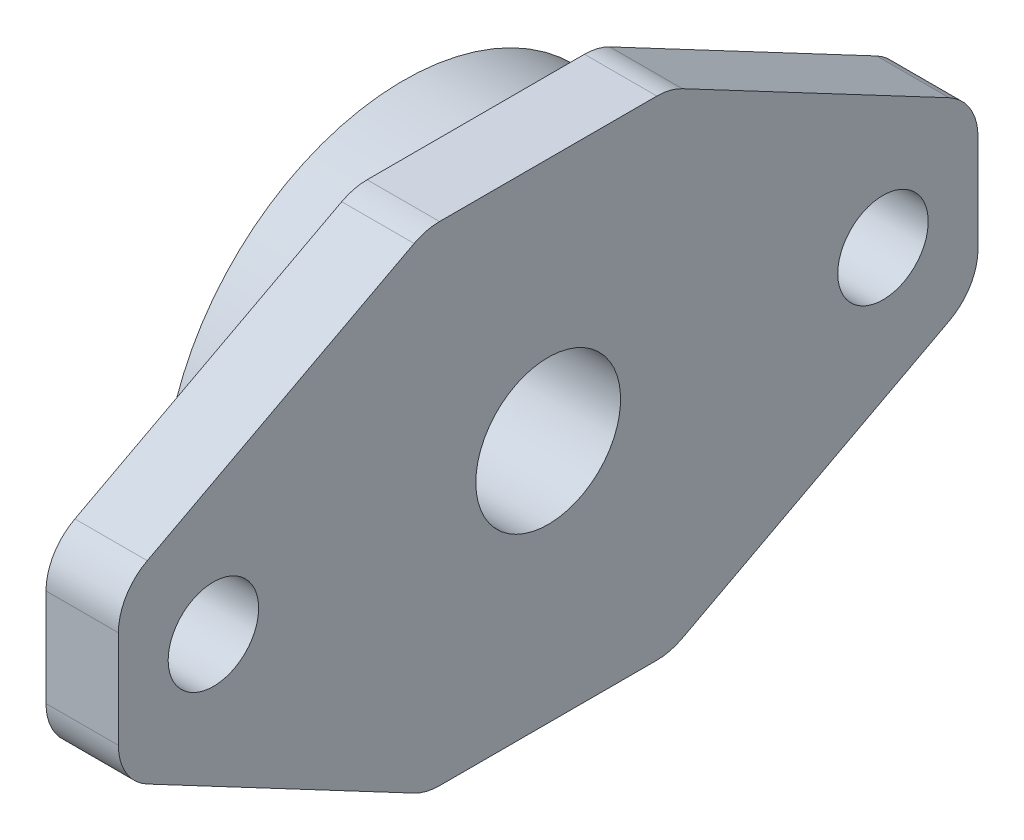
ISO-10303-21;
HEADER;
FILE_DESCRIPTION(('STEP AP214'),'2;1');
FILE_NAME('part.step','',(''),(''),'','','');
FILE_SCHEMA(('AUTOMOTIVE_DESIGN { 1 0 10303 214 1 1 1 1 }'));
ENDSEC;
DATA;
#1=APPLICATION_CONTEXT('core data for automotive mechanical design processes');
#2=APPLICATION_PROTOCOL_DEFINITION('international standard','automotive_design',2000,#1);
#3=PRODUCT_CONTEXT('',#1,'mechanical');
#4=PRODUCT('Part','Part','',(#3));
#5=PRODUCT_RELATED_PRODUCT_CATEGORY('part','',(#4));
#6=PRODUCT_DEFINITION_FORMATION('','',#4);
#7=PRODUCT_DEFINITION_CONTEXT('part definition',#1,'design');
#8=PRODUCT_DEFINITION('design','',#6,#7);
#9=PRODUCT_DEFINITION_SHAPE('','',#8);
#10=(LENGTH_UNIT() NAMED_UNIT(*) SI_UNIT(.MILLI.,.METRE.));
#11=(NAMED_UNIT(*) PLANE_ANGLE_UNIT() SI_UNIT($,.RADIAN.));
#12=(NAMED_UNIT(*) SI_UNIT($,.STERADIAN.) SOLID_ANGLE_UNIT());
#13=UNCERTAINTY_MEASURE_WITH_UNIT(LENGTH_MEASURE(1.E-05),#10,'distance_accuracy_value','');
#14=(GEOMETRIC_REPRESENTATION_CONTEXT(3) GLOBAL_UNCERTAINTY_ASSIGNED_CONTEXT((#13)) GLOBAL_UNIT_ASSIGNED_CONTEXT((#10,
#11,#12)) REPRESENTATION_CONTEXT('',''));
#15=CARTESIAN_POINT('',(0.,0.,0.));
#16=DIRECTION('',(0.,0.,1.));
#17=DIRECTION('',(1.,0.,0.));
#18=AXIS2_PLACEMENT_3D('',#15,#16,#17);
#19=CARTESIAN_POINT('',(4.,0.,0.));
#20=DIRECTION('',(0.,0.,-1.));
#21=DIRECTION('',(-1.,0.,0.));
#22=AXIS2_PLACEMENT_3D('',#19,#20,#21);
#23=PLANE('',#22);
#24=DIRECTION('',(0.,-1.,0.));
#25=VECTOR('',#24,1.);
#26=CARTESIAN_POINT('',(4.,0.,0.));
#27=LINE('',#26,#25);
#28=CARTESIAN_POINT('',(4.,16.1937557538227,0.));
#29=VERTEX_POINT('',#28);
#30=CARTESIAN_POINT('',(4.,10.8062442461773,0.));
#31=VERTEX_POINT('',#30);
#32=EDGE_CURVE('E168',#29,#31,#27,.T.);
#33=ORIENTED_EDGE('',*,*,#32,.F.);
#34=DIRECTION('',(-1.,0.,0.));
#35=VECTOR('',#34,1.);
#36=CARTESIAN_POINT('',(4.,16.1937557538227,0.));
#37=LINE('',#36,#35);
#38=CARTESIAN_POINT('',(0.,16.1937557538227,0.));
#39=VERTEX_POINT('',#38);
#40=EDGE_CURVE('E153',#29,#39,#37,.T.);
#41=ORIENTED_EDGE('',*,*,#40,.T.);
#42=DIRECTION('',(0.,-1.,0.));
#43=VECTOR('',#42,1.);
#44=CARTESIAN_POINT('',(0.,0.,0.));
#45=LINE('',#44,#43);
#46=CARTESIAN_POINT('',(0.,10.8062442461773,0.));
#47=VERTEX_POINT('',#46);
#48=EDGE_CURVE('E165',#39,#47,#45,.T.);
#49=ORIENTED_EDGE('',*,*,#48,.T.);
#50=DIRECTION('',(-1.,0.,0.));
#51=VECTOR('',#50,1.);
#52=CARTESIAN_POINT('',(4.,10.8062442461773,0.));
#53=LINE('',#52,#51);
#54=EDGE_CURVE('E170',#47,#31,#53,.F.);
#55=ORIENTED_EDGE('',*,*,#54,.T.);
#56=EDGE_LOOP('',(#33,#41,#49,#55));
#57=FACE_BOUND('',#56,.T.);
#58=ADVANCED_FACE('F34',(#57),#23,.F.);
#59=CARTESIAN_POINT('',(4.,0.,0.));
#60=DIRECTION('',(0.,1.,0.));
#61=DIRECTION('',(0.,0.,1.));
#62=AXIS2_PLACEMENT_3D('',#59,#60,#61);
#63=PLANE('',#62);
#64=DIRECTION('',(0.,0.,-1.));
#65=VECTOR('',#64,1.);
#66=CARTESIAN_POINT('',(4.,0.,0.));
#67=LINE('',#66,#65);
#68=CARTESIAN_POINT('',(4.,0.,-17.7451280205571));
#69=VERTEX_POINT('',#68);
#70=CARTESIAN_POINT('',(4.,0.,-29.7548719794429));
#71=VERTEX_POINT('',#70);
#72=EDGE_CURVE('E262',#69,#71,#67,.T.);
#73=ORIENTED_EDGE('',*,*,#72,.F.);
#74=DIRECTION('',(-1.,0.,0.));
#75=VECTOR('',#74,1.);
#76=CARTESIAN_POINT('',(4.,0.,-17.7451280205571));
#77=LINE('',#76,#75);
#78=CARTESIAN_POINT('',(0.,0.,-17.7451280205571));
#79=VERTEX_POINT('',#78);
#80=EDGE_CURVE('E241',#69,#79,#77,.T.);
#81=ORIENTED_EDGE('',*,*,#80,.T.);
#82=DIRECTION('',(0.,0.,-1.));
#83=VECTOR('',#82,1.);
#84=CARTESIAN_POINT('',(0.,0.,0.));
#85=LINE('',#84,#83);
#86=CARTESIAN_POINT('',(0.,0.,-29.7548719794429));
#87=VERTEX_POINT('',#86);
#88=EDGE_CURVE('E175',#79,#87,#85,.T.);
#89=ORIENTED_EDGE('',*,*,#88,.T.);
#90=DIRECTION('',(-1.,0.,0.));
#91=VECTOR('',#90,1.);
#92=CARTESIAN_POINT('',(4.,0.,-29.7548719794429));
#93=LINE('',#92,#91);
#94=EDGE_CURVE('E239',#87,#71,#93,.F.);
#95=ORIENTED_EDGE('',*,*,#94,.T.);
#96=EDGE_LOOP('',(#73,#81,#89,#95));
#97=FACE_BOUND('',#96,.T.);
#98=ADVANCED_FACE('F337',(#97),#63,.F.);
#99=CARTESIAN_POINT('',(4.,0.,-47.5));
#100=DIRECTION('',(0.,0.,1.));
#101=DIRECTION('',(1.,0.,0.));
#102=AXIS2_PLACEMENT_3D('',#99,#100,#101);
#103=PLANE('',#102);
#104=DIRECTION('',(0.,1.,0.));
#105=VECTOR('',#104,1.);
#106=CARTESIAN_POINT('',(4.,0.,-47.5));
#107=LINE('',#106,#105);
#108=CARTESIAN_POINT('',(4.,10.8062442461773,-47.5));
#109=VERTEX_POINT('',#108);
#110=CARTESIAN_POINT('',(4.,16.1937557538227,-47.5));
#111=VERTEX_POINT('',#110);
#112=EDGE_CURVE('E252',#109,#111,#107,.T.);
#113=ORIENTED_EDGE('',*,*,#112,.F.);
#114=DIRECTION('',(-1.,0.,0.));
#115=VECTOR('',#114,1.);
#116=CARTESIAN_POINT('',(4.,10.8062442461773,-47.5));
#117=LINE('',#116,#115);
#118=CARTESIAN_POINT('',(0.,10.8062442461773,-47.5));
#119=VERTEX_POINT('',#118);
#120=EDGE_CURVE('E11',#109,#119,#117,.T.);
#121=ORIENTED_EDGE('',*,*,#120,.T.);
#122=DIRECTION('',(0.,1.,0.));
#123=VECTOR('',#122,1.);
#124=CARTESIAN_POINT('',(0.,0.,-47.5));
#125=LINE('',#124,#123);
#126=CARTESIAN_POINT('',(0.,16.1937557538227,-47.5));
#127=VERTEX_POINT('',#126);
#128=EDGE_CURVE('E179',#119,#127,#125,.T.);
#129=ORIENTED_EDGE('',*,*,#128,.T.);
#130=DIRECTION('',(-1.,0.,0.));
#131=VECTOR('',#130,1.);
#132=CARTESIAN_POINT('',(4.,16.1937557538227,-47.5));
#133=LINE('',#132,#131);
#134=EDGE_CURVE('E42',#127,#111,#133,.F.);
#135=ORIENTED_EDGE('',*,*,#134,.T.);
#136=EDGE_LOOP('',(#113,#121,#129,#135));
#137=FACE_BOUND('',#136,.T.);
#138=ADVANCED_FACE('F251',(#137),#103,.F.);
#139=CARTESIAN_POINT('',(4.,27.,0.));
#140=DIRECTION('',(0.,-1.,0.));
#141=DIRECTION('',(0.,0.,-1.));
#142=AXIS2_PLACEMENT_3D('',#139,#140,#141);
#143=PLANE('',#142);
#144=DIRECTION('',(0.,0.,1.));
#145=VECTOR('',#144,1.);
#146=CARTESIAN_POINT('',(4.,27.,0.));
#147=LINE('',#146,#145);
#148=CARTESIAN_POINT('',(4.,27.,-29.7548719794429));
#149=VERTEX_POINT('',#148);
#150=CARTESIAN_POINT('',(4.,27.,-17.7451280205571));
#151=VERTEX_POINT('',#150);
#152=EDGE_CURVE('E185',#149,#151,#147,.T.);
#153=ORIENTED_EDGE('',*,*,#152,.F.);
#154=DIRECTION('',(-1.,0.,0.));
#155=VECTOR('',#154,1.);
#156=CARTESIAN_POINT('',(4.,27.,-29.7548719794429));
#157=LINE('',#156,#155);
#158=CARTESIAN_POINT('',(0.,27.,-29.7548719794429));
#159=VERTEX_POINT('',#158);
#160=EDGE_CURVE('E231',#149,#159,#157,.T.);
#161=ORIENTED_EDGE('',*,*,#160,.T.);
#162=DIRECTION('',(0.,0.,1.));
#163=VECTOR('',#162,1.);
#164=CARTESIAN_POINT('',(0.,27.,0.));
#165=LINE('',#164,#163);
#166=CARTESIAN_POINT('',(0.,27.,-17.7451280205571));
#167=VERTEX_POINT('',#166);
#168=EDGE_CURVE('E190',#159,#167,#165,.T.);
#169=ORIENTED_EDGE('',*,*,#168,.T.);
#170=DIRECTION('',(-1.,0.,0.));
#171=VECTOR('',#170,1.);
#172=CARTESIAN_POINT('',(4.,27.,-17.7451280205571));
#173=LINE('',#172,#171);
#174=EDGE_CURVE('E229',#167,#151,#173,.F.);
#175=ORIENTED_EDGE('',*,*,#174,.T.);
#176=EDGE_LOOP('',(#153,#161,#169,#175));
#177=FACE_BOUND('',#176,.T.);
#178=ADVANCED_FACE('F378',(#177),#143,.F.);
#179=CARTESIAN_POINT('',(4.,0.,0.));
#180=DIRECTION('',(-1.,0.,0.));
#181=DIRECTION('',(0.,0.,1.));
#182=AXIS2_PLACEMENT_3D('',#179,#180,#181);
#183=PLANE('',#182);
#184=CARTESIAN_POINT('',(4.,13.5,-5.25));
#185=DIRECTION('',(-1.,0.,0.));
#186=DIRECTION('',(0.,0.,1.));
#187=AXIS2_PLACEMENT_3D('',#184,#185,#186);
#188=CIRCLE('',#187,2.5);
#189=CARTESIAN_POINT('',(4.,13.5,-2.75));
#190=VERTEX_POINT('',#189);
#191=EDGE_CURVE('E290',#190,#190,#188,.T.);
#192=ORIENTED_EDGE('',*,*,#191,.T.);
#193=EDGE_LOOP('',(#192));
#194=FACE_BOUND('',#193,.T.);
#195=CARTESIAN_POINT('',(4.,13.5,-42.25));
#196=DIRECTION('',(-1.,0.,0.));
#197=DIRECTION('',(0.,0.,1.));
#198=AXIS2_PLACEMENT_3D('',#195,#196,#197);
#199=CIRCLE('',#198,2.5);
#200=CARTESIAN_POINT('',(4.,13.5,-39.75));
#201=VERTEX_POINT('',#200);
#202=EDGE_CURVE('E296',#201,#201,#199,.T.);
#203=ORIENTED_EDGE('',*,*,#202,.T.);
#204=EDGE_LOOP('',(#203));
#205=FACE_BOUND('',#204,.T.);
#206=CARTESIAN_POINT('',(4.,13.5,-23.75));
#207=DIRECTION('',(-1.,0.,0.));
#208=DIRECTION('',(0.,0.,1.));
#209=AXIS2_PLACEMENT_3D('',#206,#207,#208);
#210=CIRCLE('',#209,4.);
#211=CARTESIAN_POINT('',(4.,13.5,-19.75));
#212=VERTEX_POINT('',#211);
#213=EDGE_CURVE('E302',#212,#212,#210,.T.);
#214=ORIENTED_EDGE('',*,*,#213,.T.);
#215=EDGE_LOOP('',(#214));
#216=FACE_BOUND('',#215,.T.);
#217=DIRECTION('',(0.,-0.467887720419033,0.883787916347062));
#218=VECTOR('',#217,1.);
#219=CARTESIAN_POINT('',(4.,27.,-17.));
#220=LINE('',#219,#218);
#221=CARTESIAN_POINT('',(4.,26.6513637490412,-16.3414648593));
#222=VERTEX_POINT('',#221);
#223=CARTESIAN_POINT('',(4.,18.8451195028639,-1.59633683874291));
#224=VERTEX_POINT('',#223);
#225=EDGE_CURVE('E282',#222,#224,#220,.T.);
#226=ORIENTED_EDGE('',*,*,#225,.T.);
#227=CARTESIAN_POINT('',(4.,16.1937557538227,-3.));
#228=DIRECTION('',(-1.,0.,0.));
#229=DIRECTION('',(0.,0.,1.));
#230=AXIS2_PLACEMENT_3D('',#227,#228,#229);
#231=CIRCLE('',#230,3.);
#232=EDGE_CURVE('E222',#224,#29,#231,.F.);
#233=ORIENTED_EDGE('',*,*,#232,.T.);
#234=ORIENTED_EDGE('',*,*,#32,.T.);
#235=CARTESIAN_POINT('',(4.,10.8062442461773,-3.));
#236=DIRECTION('',(-1.,0.,0.));
#237=DIRECTION('',(0.,0.,1.));
#238=AXIS2_PLACEMENT_3D('',#235,#236,#237);
#239=CIRCLE('',#238,3.);
#240=CARTESIAN_POINT('',(4.,8.15488049713611,-1.59633683874291));
#241=VERTEX_POINT('',#240);
#242=EDGE_CURVE('E220',#31,#241,#239,.F.);
#243=ORIENTED_EDGE('',*,*,#242,.T.);
#244=DIRECTION('',(0.,-0.467887720419033,-0.883787916347062));
#245=VECTOR('',#244,1.);
#246=CARTESIAN_POINT('',(4.,0.,-17.));
#247=LINE('',#246,#245);
#248=CARTESIAN_POINT('',(4.,0.348636250958815,-16.3414648593));
#249=VERTEX_POINT('',#248);
#250=EDGE_CURVE('E272',#241,#249,#247,.T.);
#251=ORIENTED_EDGE('',*,*,#250,.T.);
#252=CARTESIAN_POINT('',(4.,3.,-17.7451280205571));
#253=DIRECTION('',(-1.,0.,0.));
#254=DIRECTION('',(0.,0.,1.));
#255=AXIS2_PLACEMENT_3D('',#252,#253,#254);
#256=CIRCLE('',#255,3.);
#257=EDGE_CURVE('E214',#249,#69,#256,.F.);
#258=ORIENTED_EDGE('',*,*,#257,.T.);
#259=ORIENTED_EDGE('',*,*,#72,.T.);
#260=CARTESIAN_POINT('',(4.,3.,-29.7548719794429));
#261=DIRECTION('',(-1.,0.,0.));
#262=DIRECTION('',(0.,0.,1.));
#263=AXIS2_PLACEMENT_3D('',#260,#261,#262);
#264=CIRCLE('',#263,3.);
#265=CARTESIAN_POINT('',(4.,0.348636250958814,-31.1585351407));
#266=VERTEX_POINT('',#265);
#267=EDGE_CURVE('E56',#71,#266,#264,.F.);
#268=ORIENTED_EDGE('',*,*,#267,.T.);
#269=DIRECTION('',(0.,0.467887720419033,-0.883787916347062));
#270=VECTOR('',#269,1.);
#271=CARTESIAN_POINT('',(4.,9.,-47.5));
#272=LINE('',#271,#270);
#273=CARTESIAN_POINT('',(4.,8.15488049713611,-45.9036631612571));
#274=VERTEX_POINT('',#273);
#275=EDGE_CURVE('E286',#266,#274,#272,.T.);
#276=ORIENTED_EDGE('',*,*,#275,.T.);
#277=CARTESIAN_POINT('',(4.,10.8062442461773,-44.5));
#278=DIRECTION('',(-1.,0.,0.));
#279=DIRECTION('',(0.,0.,1.));
#280=AXIS2_PLACEMENT_3D('',#277,#278,#279);
#281=CIRCLE('',#280,3.);
#282=EDGE_CURVE('E211',#274,#109,#281,.F.);
#283=ORIENTED_EDGE('',*,*,#282,.T.);
#284=ORIENTED_EDGE('',*,*,#112,.T.);
#285=CARTESIAN_POINT('',(4.,16.1937557538227,-44.5));
#286=DIRECTION('',(-1.,0.,0.));
#287=DIRECTION('',(0.,0.,1.));
#288=AXIS2_PLACEMENT_3D('',#285,#286,#287);
#289=CIRCLE('',#288,3.);
#290=CARTESIAN_POINT('',(4.,18.8451195028639,-45.9036631612571));
#291=VERTEX_POINT('',#290);
#292=EDGE_CURVE('E209',#111,#291,#289,.F.);
#293=ORIENTED_EDGE('',*,*,#292,.T.);
#294=DIRECTION('',(0.,0.467887720419033,0.883787916347062));
#295=VECTOR('',#294,1.);
#296=CARTESIAN_POINT('',(4.,18.,-47.5));
#297=LINE('',#296,#295);
#298=CARTESIAN_POINT('',(4.,26.6513637490412,-31.1585351407));
#299=VERTEX_POINT('',#298);
#300=EDGE_CURVE('E270',#291,#299,#297,.T.);
#301=ORIENTED_EDGE('',*,*,#300,.T.);
#302=CARTESIAN_POINT('',(4.,24.,-29.7548719794429));
#303=DIRECTION('',(-1.,0.,0.));
#304=DIRECTION('',(0.,0.,1.));
#305=AXIS2_PLACEMENT_3D('',#302,#303,#304);
#306=CIRCLE('',#305,3.);
#307=EDGE_CURVE('E218',#299,#149,#306,.F.);
#308=ORIENTED_EDGE('',*,*,#307,.T.);
#309=ORIENTED_EDGE('',*,*,#152,.T.);
#310=CARTESIAN_POINT('',(4.,24.,-17.7451280205571));
#311=DIRECTION('',(-1.,0.,0.));
#312=DIRECTION('',(0.,0.,1.));
#313=AXIS2_PLACEMENT_3D('',#310,#311,#312);
#314=CIRCLE('',#313,3.);
#315=EDGE_CURVE('E216',#151,#222,#314,.F.);
#316=ORIENTED_EDGE('',*,*,#315,.T.);
#317=EDGE_LOOP('',(#226,#233,#234,#243,#251,#258,#259,#268,#276,#283,#284,#293,#301,#308,#309,#316));
#318=FACE_BOUND('',#317,.T.);
#319=ADVANCED_FACE('F258',(#194,#205,#216,#318),#183,.F.);
#320=CARTESIAN_POINT('',(0.,0.,0.));
#321=DIRECTION('',(-1.,0.,0.));
#322=DIRECTION('',(0.,0.,1.));
#323=AXIS2_PLACEMENT_3D('',#320,#321,#322);
#324=PLANE('',#323);
#325=ORIENTED_EDGE('',*,*,#48,.F.);
#326=CARTESIAN_POINT('',(0.,16.1937557538227,-3.));
#327=DIRECTION('',(-1.,0.,0.));
#328=DIRECTION('',(0.,0.,1.));
#329=AXIS2_PLACEMENT_3D('',#326,#327,#328);
#330=CIRCLE('',#329,3.);
#331=CARTESIAN_POINT('',(0.,18.8451195028639,-1.59633683874291));
#332=VERTEX_POINT('',#331);
#333=EDGE_CURVE('E149',#39,#332,#330,.T.);
#334=ORIENTED_EDGE('',*,*,#333,.T.);
#335=DIRECTION('',(0.,-0.467887720419033,0.883787916347062));
#336=VECTOR('',#335,1.);
#337=CARTESIAN_POINT('',(0.,27.,-17.));
#338=LINE('',#337,#336);
#339=CARTESIAN_POINT('',(0.,26.6513637490412,-16.3414648593));
#340=VERTEX_POINT('',#339);
#341=EDGE_CURVE('E284',#340,#332,#338,.T.);
#342=ORIENTED_EDGE('',*,*,#341,.F.);
#343=CARTESIAN_POINT('',(0.,24.,-17.7451280205571));
#344=DIRECTION('',(-1.,0.,0.));
#345=DIRECTION('',(0.,0.,1.));
#346=AXIS2_PLACEMENT_3D('',#343,#344,#345);
#347=CIRCLE('',#346,3.);
#348=EDGE_CURVE('E201',#340,#167,#347,.T.);
#349=ORIENTED_EDGE('',*,*,#348,.T.);
#350=ORIENTED_EDGE('',*,*,#168,.F.);
#351=CARTESIAN_POINT('',(0.,24.,-29.7548719794429));
#352=DIRECTION('',(-1.,0.,0.));
#353=DIRECTION('',(0.,0.,1.));
#354=AXIS2_PLACEMENT_3D('',#351,#352,#353);
#355=CIRCLE('',#354,3.);
#356=CARTESIAN_POINT('',(0.,26.6513637490412,-31.1585351407));
#357=VERTEX_POINT('',#356);
#358=EDGE_CURVE('E203',#159,#357,#355,.T.);
#359=ORIENTED_EDGE('',*,*,#358,.T.);
#360=DIRECTION('',(0.,0.467887720419033,0.883787916347062));
#361=VECTOR('',#360,1.);
#362=CARTESIAN_POINT('',(0.,18.,-47.5));
#363=LINE('',#362,#361);
#364=CARTESIAN_POINT('',(0.,18.8451195028639,-45.9036631612571));
#365=VERTEX_POINT('',#364);
#366=EDGE_CURVE('E268',#365,#357,#363,.T.);
#367=ORIENTED_EDGE('',*,*,#366,.F.);
#368=CARTESIAN_POINT('',(0.,16.1937557538227,-44.5));
#369=DIRECTION('',(-1.,0.,0.));
#370=DIRECTION('',(0.,0.,1.));
#371=AXIS2_PLACEMENT_3D('',#368,#369,#370);
#372=CIRCLE('',#371,3.);
#373=EDGE_CURVE('E169',#365,#127,#372,.T.);
#374=ORIENTED_EDGE('',*,*,#373,.T.);
#375=ORIENTED_EDGE('',*,*,#128,.F.);
#376=CARTESIAN_POINT('',(0.,10.8062442461773,-44.5));
#377=DIRECTION('',(-1.,0.,0.));
#378=DIRECTION('',(0.,0.,1.));
#379=AXIS2_PLACEMENT_3D('',#376,#377,#378);
#380=CIRCLE('',#379,3.);
#381=CARTESIAN_POINT('',(0.,8.15488049713611,-45.9036631612571));
#382=VERTEX_POINT('',#381);
#383=EDGE_CURVE('E195',#119,#382,#380,.T.);
#384=ORIENTED_EDGE('',*,*,#383,.T.);
#385=DIRECTION('',(0.,0.467887720419033,-0.883787916347062));
#386=VECTOR('',#385,1.);
#387=CARTESIAN_POINT('',(0.,9.,-47.5));
#388=LINE('',#387,#386);
#389=CARTESIAN_POINT('',(0.,0.348636250958814,-31.1585351407));
#390=VERTEX_POINT('',#389);
#391=EDGE_CURVE('E274',#390,#382,#388,.T.);
#392=ORIENTED_EDGE('',*,*,#391,.F.);
#393=CARTESIAN_POINT('',(0.,3.,-29.7548719794429));
#394=DIRECTION('',(-1.,0.,0.));
#395=DIRECTION('',(0.,0.,1.));
#396=AXIS2_PLACEMENT_3D('',#393,#394,#395);
#397=CIRCLE('',#396,3.);
#398=EDGE_CURVE('E197',#390,#87,#397,.T.);
#399=ORIENTED_EDGE('',*,*,#398,.T.);
#400=ORIENTED_EDGE('',*,*,#88,.F.);
#401=CARTESIAN_POINT('',(0.,3.,-17.7451280205571));
#402=DIRECTION('',(-1.,0.,0.));
#403=DIRECTION('',(0.,0.,1.));
#404=AXIS2_PLACEMENT_3D('',#401,#402,#403);
#405=CIRCLE('',#404,3.);
#406=CARTESIAN_POINT('',(0.,0.348636250958815,-16.3414648593));
#407=VERTEX_POINT('',#406);
#408=EDGE_CURVE('E199',#79,#407,#405,.T.);
#409=ORIENTED_EDGE('',*,*,#408,.T.);
#410=DIRECTION('',(0.,-0.467887720419033,-0.883787916347062));
#411=VECTOR('',#410,1.);
#412=CARTESIAN_POINT('',(0.,0.,-17.));
#413=LINE('',#412,#411);
#414=CARTESIAN_POINT('',(0.,8.15488049713611,-1.59633683874291));
#415=VERTEX_POINT('',#414);
#416=EDGE_CURVE('E277',#415,#407,#413,.T.);
#417=ORIENTED_EDGE('',*,*,#416,.F.);
#418=CARTESIAN_POINT('',(0.,10.8062442461773,-3.));
#419=DIRECTION('',(-1.,0.,0.));
#420=DIRECTION('',(0.,0.,1.));
#421=AXIS2_PLACEMENT_3D('',#418,#419,#420);
#422=CIRCLE('',#421,3.);
#423=EDGE_CURVE('E160',#415,#47,#422,.T.);
#424=ORIENTED_EDGE('',*,*,#423,.T.);
#425=EDGE_LOOP('',(#325,#334,#342,#349,#350,#359,#367,#374,#375,#384,#392,#399,#400,#409,#417,#424));
#426=FACE_BOUND('',#425,.T.);
#427=CARTESIAN_POINT('',(0.,13.5,-5.25));
#428=DIRECTION('',(-1.,0.,0.));
#429=DIRECTION('',(0.,0.,1.));
#430=AXIS2_PLACEMENT_3D('',#427,#428,#429);
#431=CIRCLE('',#430,2.5);
#432=CARTESIAN_POINT('',(0.,13.5,-2.75));
#433=VERTEX_POINT('',#432);
#434=EDGE_CURVE('E288',#433,#433,#431,.T.);
#435=ORIENTED_EDGE('',*,*,#434,.F.);
#436=EDGE_LOOP('',(#435));
#437=FACE_BOUND('',#436,.T.);
#438=CARTESIAN_POINT('',(0.,13.5,-42.25));
#439=DIRECTION('',(-1.,0.,0.));
#440=DIRECTION('',(0.,0.,1.));
#441=AXIS2_PLACEMENT_3D('',#438,#439,#440);
#442=CIRCLE('',#441,2.5);
#443=CARTESIAN_POINT('',(0.,13.5,-39.75));
#444=VERTEX_POINT('',#443);
#445=EDGE_CURVE('E293',#444,#444,#442,.T.);
#446=ORIENTED_EDGE('',*,*,#445,.F.);
#447=EDGE_LOOP('',(#446));
#448=FACE_BOUND('',#447,.T.);
#449=CARTESIAN_POINT('',(0.,13.5,-23.75));
#450=DIRECTION('',(-1.,0.,0.));
#451=DIRECTION('',(0.,0.,1.));
#452=AXIS2_PLACEMENT_3D('',#449,#450,#451);
#453=CIRCLE('',#452,13.25);
#454=CARTESIAN_POINT('',(0.,13.5,-10.5));
#455=VERTEX_POINT('',#454);
#456=EDGE_CURVE('E182',#455,#455,#453,.T.);
#457=ORIENTED_EDGE('',*,*,#456,.F.);
#458=EDGE_LOOP('',(#457));
#459=FACE_BOUND('',#458,.T.);
#460=ADVANCED_FACE('F172',(#426,#437,#448,#459),#324,.T.);
#461=CARTESIAN_POINT('',(-4.,13.5,-23.75));
#462=DIRECTION('',(1.,0.,0.));
#463=DIRECTION('',(0.,0.,-1.));
#464=AXIS2_PLACEMENT_3D('',#461,#462,#463);
#465=CYLINDRICAL_SURFACE('',#464,13.25);
#466=CARTESIAN_POINT('',(-4.,13.5,-23.75));
#467=DIRECTION('',(-1.,0.,0.));
#468=DIRECTION('',(0.,0.,1.));
#469=AXIS2_PLACEMENT_3D('',#466,#467,#468);
#470=CIRCLE('',#469,13.25);
#471=CARTESIAN_POINT('',(-4.,13.5,-10.5));
#472=VERTEX_POINT('',#471);
#473=EDGE_CURVE('E176',#472,#472,#470,.T.);
#474=ORIENTED_EDGE('',*,*,#473,.F.);
#475=EDGE_LOOP('',(#474));
#476=FACE_BOUND('',#475,.T.);
#477=ORIENTED_EDGE('',*,*,#456,.T.);
#478=EDGE_LOOP('',(#477));
#479=FACE_BOUND('',#478,.T.);
#480=ADVANCED_FACE('F391',(#476,#479),#465,.T.);
#481=CARTESIAN_POINT('',(-4.,13.5,-23.75));
#482=DIRECTION('',(-1.,0.,0.));
#483=DIRECTION('',(0.,0.,1.));
#484=AXIS2_PLACEMENT_3D('',#481,#482,#483);
#485=PLANE('',#484);
#486=CARTESIAN_POINT('',(-4.,13.5,-23.75));
#487=DIRECTION('',(-1.,0.,0.));
#488=DIRECTION('',(0.,0.,1.));
#489=AXIS2_PLACEMENT_3D('',#486,#487,#488);
#490=CIRCLE('',#489,6.);
#491=CARTESIAN_POINT('',(-4.,13.5,-17.75));
#492=VERTEX_POINT('',#491);
#493=EDGE_CURVE('E305',#492,#492,#490,.T.);
#494=ORIENTED_EDGE('',*,*,#493,.F.);
#495=EDGE_LOOP('',(#494));
#496=FACE_BOUND('',#495,.T.);
#497=ORIENTED_EDGE('',*,*,#473,.T.);
#498=EDGE_LOOP('',(#497));
#499=FACE_BOUND('',#498,.T.);
#500=ADVANCED_FACE('F395',(#496,#499),#485,.T.);
#501=CARTESIAN_POINT('',(-7.5,13.5,-23.75));
#502=DIRECTION('',(1.,0.,0.));
#503=DIRECTION('',(0.,0.,-1.));
#504=AXIS2_PLACEMENT_3D('',#501,#502,#503);
#505=CYLINDRICAL_SURFACE('',#504,6.);
#506=CARTESIAN_POINT('',(-7.5,13.5,-23.75));
#507=DIRECTION('',(-1.,0.,0.));
#508=DIRECTION('',(0.,0.,1.));
#509=AXIS2_PLACEMENT_3D('',#506,#507,#508);
#510=CIRCLE('',#509,6.);
#511=CARTESIAN_POINT('',(-7.5,13.5,-17.75));
#512=VERTEX_POINT('',#511);
#513=EDGE_CURVE('E308',#512,#512,#510,.T.);
#514=ORIENTED_EDGE('',*,*,#513,.F.);
#515=EDGE_LOOP('',(#514));
#516=FACE_BOUND('',#515,.T.);
#517=ORIENTED_EDGE('',*,*,#493,.T.);
#518=EDGE_LOOP('',(#517));
#519=FACE_BOUND('',#518,.T.);
#520=ADVANCED_FACE('F399',(#516,#519),#505,.T.);
#521=CARTESIAN_POINT('',(-7.5,13.5,-23.75));
#522=DIRECTION('',(-1.,0.,0.));
#523=DIRECTION('',(0.,0.,1.));
#524=AXIS2_PLACEMENT_3D('',#521,#522,#523);
#525=PLANE('',#524);
#526=CARTESIAN_POINT('',(-7.5,13.5,-23.75));
#527=DIRECTION('',(-1.,0.,0.));
#528=DIRECTION('',(0.,0.,1.));
#529=AXIS2_PLACEMENT_3D('',#526,#527,#528);
#530=CIRCLE('',#529,4.);
#531=CARTESIAN_POINT('',(-7.5,13.5,-19.75));
#532=VERTEX_POINT('',#531);
#533=EDGE_CURVE('E299',#532,#532,#530,.T.);
#534=ORIENTED_EDGE('',*,*,#533,.F.);
#535=EDGE_LOOP('',(#534));
#536=FACE_BOUND('',#535,.T.);
#537=ORIENTED_EDGE('',*,*,#513,.T.);
#538=EDGE_LOOP('',(#537));
#539=FACE_BOUND('',#538,.T.);
#540=ADVANCED_FACE('F403',(#536,#539),#525,.T.);
#541=CARTESIAN_POINT('',(4.,13.5,-23.75));
#542=DIRECTION('',(-1.,0.,0.));
#543=DIRECTION('',(0.,0.,1.));
#544=AXIS2_PLACEMENT_3D('',#541,#542,#543);
#545=CYLINDRICAL_SURFACE('',#544,4.);
#546=ORIENTED_EDGE('',*,*,#213,.F.);
#547=EDGE_LOOP('',(#546));
#548=FACE_BOUND('',#547,.T.);
#549=ORIENTED_EDGE('',*,*,#533,.T.);
#550=EDGE_LOOP('',(#549));
#551=FACE_BOUND('',#550,.T.);
#552=ADVANCED_FACE('F407',(#548,#551),#545,.F.);
#553=CARTESIAN_POINT('',(4.,13.5,-42.25));
#554=DIRECTION('',(-1.,0.,0.));
#555=DIRECTION('',(0.,0.,1.));
#556=AXIS2_PLACEMENT_3D('',#553,#554,#555);
#557=CYLINDRICAL_SURFACE('',#556,2.5);
#558=ORIENTED_EDGE('',*,*,#202,.F.);
#559=EDGE_LOOP('',(#558));
#560=FACE_BOUND('',#559,.T.);
#561=ORIENTED_EDGE('',*,*,#445,.T.);
#562=EDGE_LOOP('',(#561));
#563=FACE_BOUND('',#562,.T.);
#564=ADVANCED_FACE('F411',(#560,#563),#557,.F.);
#565=CARTESIAN_POINT('',(4.,13.5,-5.25));
#566=DIRECTION('',(-1.,0.,0.));
#567=DIRECTION('',(0.,0.,1.));
#568=AXIS2_PLACEMENT_3D('',#565,#566,#567);
#569=CYLINDRICAL_SURFACE('',#568,2.5);
#570=ORIENTED_EDGE('',*,*,#191,.F.);
#571=EDGE_LOOP('',(#570));
#572=FACE_BOUND('',#571,.T.);
#573=ORIENTED_EDGE('',*,*,#434,.T.);
#574=EDGE_LOOP('',(#573));
#575=FACE_BOUND('',#574,.T.);
#576=ADVANCED_FACE('F415',(#572,#575),#569,.F.);
#577=CARTESIAN_POINT('',(4.,9.,-47.5));
#578=DIRECTION('',(0.,0.883787916347062,0.467887720419033));
#579=DIRECTION('',(0.,-0.467887720419033,0.883787916347062));
#580=AXIS2_PLACEMENT_3D('',#577,#578,#579);
#581=PLANE('',#580);
#582=ORIENTED_EDGE('',*,*,#275,.F.);
#583=DIRECTION('',(-1.,0.,0.));
#584=VECTOR('',#583,1.);
#585=CARTESIAN_POINT('',(4.,0.348636250958812,-31.1585351407));
#586=LINE('',#585,#584);
#587=EDGE_CURVE('E245',#266,#390,#586,.T.);
#588=ORIENTED_EDGE('',*,*,#587,.T.);
#589=ORIENTED_EDGE('',*,*,#391,.T.);
#590=DIRECTION('',(-1.,0.,0.));
#591=VECTOR('',#590,1.);
#592=CARTESIAN_POINT('',(4.,8.15488049713611,-45.9036631612571));
#593=LINE('',#592,#591);
#594=EDGE_CURVE('E49',#382,#274,#593,.F.);
#595=ORIENTED_EDGE('',*,*,#594,.T.);
#596=EDGE_LOOP('',(#582,#588,#589,#595));
#597=FACE_BOUND('',#596,.T.);
#598=ADVANCED_FACE('F325',(#597),#581,.F.);
#599=CARTESIAN_POINT('',(4.,27.,-17.));
#600=DIRECTION('',(0.,-0.883787916347062,-0.467887720419033));
#601=DIRECTION('',(0.,0.467887720419033,-0.883787916347062));
#602=AXIS2_PLACEMENT_3D('',#599,#600,#601);
#603=PLANE('',#602);
#604=ORIENTED_EDGE('',*,*,#341,.T.);
#605=DIRECTION('',(-1.,0.,0.));
#606=VECTOR('',#605,1.);
#607=CARTESIAN_POINT('',(4.,18.8451195028639,-1.5963368387429));
#608=LINE('',#607,#606);
#609=EDGE_CURVE('E154',#332,#224,#608,.F.);
#610=ORIENTED_EDGE('',*,*,#609,.T.);
#611=ORIENTED_EDGE('',*,*,#225,.F.);
#612=DIRECTION('',(-1.,0.,0.));
#613=VECTOR('',#612,1.);
#614=CARTESIAN_POINT('',(4.,26.6513637490412,-16.3414648593));
#615=LINE('',#614,#613);
#616=EDGE_CURVE('E159',#222,#340,#615,.T.);
#617=ORIENTED_EDGE('',*,*,#616,.T.);
#618=EDGE_LOOP('',(#604,#610,#611,#617));
#619=FACE_BOUND('',#618,.T.);
#620=ADVANCED_FACE('F374',(#619),#603,.F.);
#621=CARTESIAN_POINT('',(4.,0.,-17.));
#622=DIRECTION('',(0.,0.883787916347062,-0.467887720419033));
#623=DIRECTION('',(0.,0.467887720419033,0.883787916347062));
#624=AXIS2_PLACEMENT_3D('',#621,#622,#623);
#625=PLANE('',#624);
#626=ORIENTED_EDGE('',*,*,#250,.F.);
#627=DIRECTION('',(-1.,0.,0.));
#628=VECTOR('',#627,1.);
#629=CARTESIAN_POINT('',(4.,8.15488049713611,-1.5963368387429));
#630=LINE('',#629,#628);
#631=EDGE_CURVE('E226',#241,#415,#630,.T.);
#632=ORIENTED_EDGE('',*,*,#631,.T.);
#633=ORIENTED_EDGE('',*,*,#416,.T.);
#634=DIRECTION('',(-1.,0.,0.));
#635=VECTOR('',#634,1.);
#636=CARTESIAN_POINT('',(4.,0.348636250958815,-16.3414648593));
#637=LINE('',#636,#635);
#638=EDGE_CURVE('E224',#407,#249,#637,.F.);
#639=ORIENTED_EDGE('',*,*,#638,.T.);
#640=EDGE_LOOP('',(#626,#632,#633,#639));
#641=FACE_BOUND('',#640,.T.);
#642=ADVANCED_FACE('F366',(#641),#625,.F.);
#643=CARTESIAN_POINT('',(4.,18.,-47.5));
#644=DIRECTION('',(0.,-0.883787916347062,0.467887720419033));
#645=DIRECTION('',(0.,-0.467887720419033,-0.883787916347062));
#646=AXIS2_PLACEMENT_3D('',#643,#644,#645);
#647=PLANE('',#646);
#648=ORIENTED_EDGE('',*,*,#366,.T.);
#649=DIRECTION('',(-1.,0.,0.));
#650=VECTOR('',#649,1.);
#651=CARTESIAN_POINT('',(4.,26.6513637490412,-31.1585351407));
#652=LINE('',#651,#650);
#653=EDGE_CURVE('E237',#357,#299,#652,.F.);
#654=ORIENTED_EDGE('',*,*,#653,.T.);
#655=ORIENTED_EDGE('',*,*,#300,.F.);
#656=DIRECTION('',(-1.,0.,0.));
#657=VECTOR('',#656,1.);
#658=CARTESIAN_POINT('',(4.,18.8451195028639,-45.9036631612571));
#659=LINE('',#658,#657);
#660=EDGE_CURVE('E234',#291,#365,#659,.T.);
#661=ORIENTED_EDGE('',*,*,#660,.T.);
#662=EDGE_LOOP('',(#648,#654,#655,#661));
#663=FACE_BOUND('',#662,.T.);
#664=ADVANCED_FACE('F267',(#663),#647,.F.);
#665=CARTESIAN_POINT('',(4.,16.1937557538227,-3.));
#666=DIRECTION('',(-1.,0.,0.));
#667=DIRECTION('',(0.,0.,1.));
#668=AXIS2_PLACEMENT_3D('',#665,#666,#667);
#669=CYLINDRICAL_SURFACE('',#668,3.);
#670=ORIENTED_EDGE('',*,*,#232,.F.);
#671=ORIENTED_EDGE('',*,*,#609,.F.);
#672=ORIENTED_EDGE('',*,*,#333,.F.);
#673=ORIENTED_EDGE('',*,*,#40,.F.);
#674=EDGE_LOOP('',(#670,#671,#672,#673));
#675=FACE_BOUND('',#674,.T.);
#676=ADVANCED_FACE('F152',(#675),#669,.T.);
#677=CARTESIAN_POINT('',(4.,10.8062442461773,-3.));
#678=DIRECTION('',(-1.,0.,0.));
#679=DIRECTION('',(0.,0.,1.));
#680=AXIS2_PLACEMENT_3D('',#677,#678,#679);
#681=CYLINDRICAL_SURFACE('',#680,3.);
#682=ORIENTED_EDGE('',*,*,#242,.F.);
#683=ORIENTED_EDGE('',*,*,#54,.F.);
#684=ORIENTED_EDGE('',*,*,#423,.F.);
#685=ORIENTED_EDGE('',*,*,#631,.F.);
#686=EDGE_LOOP('',(#682,#683,#684,#685));
#687=FACE_BOUND('',#686,.T.);
#688=ADVANCED_FACE('F347',(#687),#681,.T.);
#689=CARTESIAN_POINT('',(4.,24.,-29.7548719794429));
#690=DIRECTION('',(-1.,0.,0.));
#691=DIRECTION('',(0.,0.,1.));
#692=AXIS2_PLACEMENT_3D('',#689,#690,#691);
#693=CYLINDRICAL_SURFACE('',#692,3.);
#694=ORIENTED_EDGE('',*,*,#307,.F.);
#695=ORIENTED_EDGE('',*,*,#653,.F.);
#696=ORIENTED_EDGE('',*,*,#358,.F.);
#697=ORIENTED_EDGE('',*,*,#160,.F.);
#698=EDGE_LOOP('',(#694,#695,#696,#697));
#699=FACE_BOUND('',#698,.T.);
#700=ADVANCED_FACE('F350',(#699),#693,.T.);
#701=CARTESIAN_POINT('',(4.,24.,-17.7451280205571));
#702=DIRECTION('',(-1.,0.,0.));
#703=DIRECTION('',(0.,0.,1.));
#704=AXIS2_PLACEMENT_3D('',#701,#702,#703);
#705=CYLINDRICAL_SURFACE('',#704,3.);
#706=ORIENTED_EDGE('',*,*,#315,.F.);
#707=ORIENTED_EDGE('',*,*,#174,.F.);
#708=ORIENTED_EDGE('',*,*,#348,.F.);
#709=ORIENTED_EDGE('',*,*,#616,.F.);
#710=EDGE_LOOP('',(#706,#707,#708,#709));
#711=FACE_BOUND('',#710,.T.);
#712=ADVANCED_FACE('F354',(#711),#705,.T.);
#713=CARTESIAN_POINT('',(4.,3.,-17.7451280205571));
#714=DIRECTION('',(-1.,0.,0.));
#715=DIRECTION('',(0.,0.,1.));
#716=AXIS2_PLACEMENT_3D('',#713,#714,#715);
#717=CYLINDRICAL_SURFACE('',#716,3.);
#718=ORIENTED_EDGE('',*,*,#257,.F.);
#719=ORIENTED_EDGE('',*,*,#638,.F.);
#720=ORIENTED_EDGE('',*,*,#408,.F.);
#721=ORIENTED_EDGE('',*,*,#80,.F.);
#722=EDGE_LOOP('',(#718,#719,#720,#721));
#723=FACE_BOUND('',#722,.T.);
#724=ADVANCED_FACE('F334',(#723),#717,.T.);
#725=CARTESIAN_POINT('',(4.,3.,-29.7548719794429));
#726=DIRECTION('',(-1.,0.,0.));
#727=DIRECTION('',(0.,0.,1.));
#728=AXIS2_PLACEMENT_3D('',#725,#726,#727);
#729=CYLINDRICAL_SURFACE('',#728,3.);
#730=ORIENTED_EDGE('',*,*,#267,.F.);
#731=ORIENTED_EDGE('',*,*,#94,.F.);
#732=ORIENTED_EDGE('',*,*,#398,.F.);
#733=ORIENTED_EDGE('',*,*,#587,.F.);
#734=EDGE_LOOP('',(#730,#731,#732,#733));
#735=FACE_BOUND('',#734,.T.);
#736=ADVANCED_FACE('F323',(#735),#729,.T.);
#737=CARTESIAN_POINT('',(4.,10.8062442461773,-44.5));
#738=DIRECTION('',(-1.,0.,0.));
#739=DIRECTION('',(0.,0.,1.));
#740=AXIS2_PLACEMENT_3D('',#737,#738,#739);
#741=CYLINDRICAL_SURFACE('',#740,3.);
#742=ORIENTED_EDGE('',*,*,#282,.F.);
#743=ORIENTED_EDGE('',*,*,#594,.F.);
#744=ORIENTED_EDGE('',*,*,#383,.F.);
#745=ORIENTED_EDGE('',*,*,#120,.F.);
#746=EDGE_LOOP('',(#742,#743,#744,#745));
#747=FACE_BOUND('',#746,.T.);
#748=ADVANCED_FACE('F328',(#747),#741,.T.);
#749=CARTESIAN_POINT('',(4.,16.1937557538227,-44.5));
#750=DIRECTION('',(-1.,0.,0.));
#751=DIRECTION('',(0.,0.,1.));
#752=AXIS2_PLACEMENT_3D('',#749,#750,#751);
#753=CYLINDRICAL_SURFACE('',#752,3.);
#754=ORIENTED_EDGE('',*,*,#292,.F.);
#755=ORIENTED_EDGE('',*,*,#134,.F.);
#756=ORIENTED_EDGE('',*,*,#373,.F.);
#757=ORIENTED_EDGE('',*,*,#660,.F.);
#758=EDGE_LOOP('',(#754,#755,#756,#757));
#759=FACE_BOUND('',#758,.T.);
#760=ADVANCED_FACE('F36',(#759),#753,.T.);
#761=CLOSED_SHELL('',(#58,#98,#138,#178,#319,#460,#480,#500,#520,#540,#552,#564,#576,#598,#620,
#642,#664,#676,#688,#700,#712,#724,#736,#748,#760));
#762=MANIFOLD_SOLID_BREP('B2',#761);
#763=ADVANCED_BREP_SHAPE_REPRESENTATION('',(#18,#762),#14);
#764=SHAPE_DEFINITION_REPRESENTATION(#9,#763);
ENDSEC;
END-ISO-10303-21;
